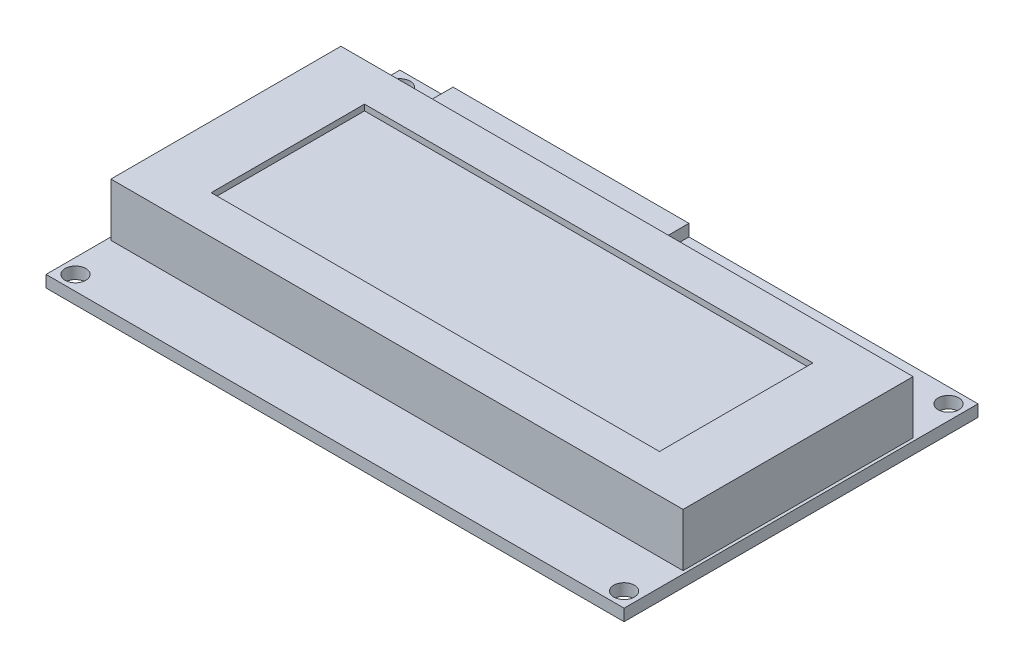
ISO-10303-21;
HEADER;
FILE_DESCRIPTION(('STEP AP214'),'2;1');
FILE_NAME('part.step','',(''),(''),'','','');
FILE_SCHEMA(('AUTOMOTIVE_DESIGN { 1 0 10303 214 1 1 1 1 }'));
ENDSEC;
DATA;
#1=APPLICATION_CONTEXT('core data for automotive mechanical design processes');
#2=APPLICATION_PROTOCOL_DEFINITION('international standard','automotive_design',2000,#1);
#3=PRODUCT_CONTEXT('',#1,'mechanical');
#4=PRODUCT('Part','Part','',(#3));
#5=PRODUCT_RELATED_PRODUCT_CATEGORY('part','',(#4));
#6=PRODUCT_DEFINITION_FORMATION('','',#4);
#7=PRODUCT_DEFINITION_CONTEXT('part definition',#1,'design');
#8=PRODUCT_DEFINITION('design','',#6,#7);
#9=PRODUCT_DEFINITION_SHAPE('','',#8);
#10=(LENGTH_UNIT() NAMED_UNIT(*) SI_UNIT(.MILLI.,.METRE.));
#11=(NAMED_UNIT(*) PLANE_ANGLE_UNIT() SI_UNIT($,.RADIAN.));
#12=(NAMED_UNIT(*) SI_UNIT($,.STERADIAN.) SOLID_ANGLE_UNIT());
#13=UNCERTAINTY_MEASURE_WITH_UNIT(LENGTH_MEASURE(1.E-05),#10,'distance_accuracy_value','');
#14=(GEOMETRIC_REPRESENTATION_CONTEXT(3) GLOBAL_UNCERTAINTY_ASSIGNED_CONTEXT((#13)) GLOBAL_UNIT_ASSIGNED_CONTEXT((#10,
#11,#12)) REPRESENTATION_CONTEXT('',''));
#15=CARTESIAN_POINT('',(0.,0.,0.));
#16=DIRECTION('',(0.,0.,1.));
#17=DIRECTION('',(1.,0.,0.));
#18=AXIS2_PLACEMENT_3D('',#15,#16,#17);
#19=CARTESIAN_POINT('',(-40.,4.,-30.));
#20=DIRECTION('',(1.,0.,0.));
#21=DIRECTION('',(0.,0.,-1.));
#22=AXIS2_PLACEMENT_3D('',#19,#20,#21);
#23=PLANE('',#22);
#24=DIRECTION('',(0.,0.,1.));
#25=VECTOR('',#24,1.);
#26=CARTESIAN_POINT('',(-40.,2.,-30.));
#27=LINE('',#26,#25);
#28=CARTESIAN_POINT('',(-40.,2.,-30.));
#29=VERTEX_POINT('',#28);
#30=CARTESIAN_POINT('',(-40.,2.,-26.));
#31=VERTEX_POINT('',#30);
#32=EDGE_CURVE('E112',#29,#31,#27,.T.);
#33=ORIENTED_EDGE('',*,*,#32,.T.);
#34=DIRECTION('',(0.,-1.,0.));
#35=VECTOR('',#34,1.);
#36=CARTESIAN_POINT('',(-40.,4.,-26.));
#37=LINE('',#36,#35);
#38=CARTESIAN_POINT('',(-40.,4.,-26.));
#39=VERTEX_POINT('',#38);
#40=EDGE_CURVE('E12',#39,#31,#37,.T.);
#41=ORIENTED_EDGE('',*,*,#40,.F.);
#42=DIRECTION('',(0.,0.,1.));
#43=VECTOR('',#42,1.);
#44=CARTESIAN_POINT('',(-40.,4.,-30.));
#45=LINE('',#44,#43);
#46=CARTESIAN_POINT('',(-40.,4.,-30.));
#47=VERTEX_POINT('',#46);
#48=EDGE_CURVE('E100',#47,#39,#45,.T.);
#49=ORIENTED_EDGE('',*,*,#48,.F.);
#50=DIRECTION('',(0.,-1.,0.));
#51=VECTOR('',#50,1.);
#52=CARTESIAN_POINT('',(-40.,4.,-30.));
#53=LINE('',#52,#51);
#54=EDGE_CURVE('E108',#47,#29,#53,.T.);
#55=ORIENTED_EDGE('',*,*,#54,.T.);
#56=EDGE_LOOP('',(#33,#41,#49,#55));
#57=FACE_BOUND('',#56,.T.);
#58=ADVANCED_FACE('F49',(#57),#23,.F.);
#59=CARTESIAN_POINT('',(-40.,4.,-26.));
#60=DIRECTION('',(0.,0.,-1.));
#61=DIRECTION('',(-1.,0.,0.));
#62=AXIS2_PLACEMENT_3D('',#59,#60,#61);
#63=PLANE('',#62);
#64=DIRECTION('',(1.,0.,0.));
#65=VECTOR('',#64,1.);
#66=CARTESIAN_POINT('',(-40.,2.,-26.));
#67=LINE('',#66,#65);
#68=CARTESIAN_POINT('',(0.,2.,-26.));
#69=VERTEX_POINT('',#68);
#70=EDGE_CURVE('E104',#31,#69,#67,.T.);
#71=ORIENTED_EDGE('',*,*,#70,.T.);
#72=DIRECTION('',(0.,-1.,0.));
#73=VECTOR('',#72,1.);
#74=CARTESIAN_POINT('',(0.,4.,-26.));
#75=LINE('',#74,#73);
#76=CARTESIAN_POINT('',(0.,4.,-26.));
#77=VERTEX_POINT('',#76);
#78=EDGE_CURVE('E57',#77,#69,#75,.T.);
#79=ORIENTED_EDGE('',*,*,#78,.F.);
#80=DIRECTION('',(1.,0.,0.));
#81=VECTOR('',#80,1.);
#82=CARTESIAN_POINT('',(-40.,4.,-26.));
#83=LINE('',#82,#81);
#84=EDGE_CURVE('E95',#39,#77,#83,.T.);
#85=ORIENTED_EDGE('',*,*,#84,.F.);
#86=ORIENTED_EDGE('',*,*,#40,.T.);
#87=EDGE_LOOP('',(#71,#79,#85,#86));
#88=FACE_BOUND('',#87,.T.);
#89=ADVANCED_FACE('F103',(#88),#63,.F.);
#90=CARTESIAN_POINT('',(0.,4.,-30.));
#91=DIRECTION('',(-1.,0.,0.));
#92=DIRECTION('',(0.,0.,1.));
#93=AXIS2_PLACEMENT_3D('',#90,#91,#92);
#94=PLANE('',#93);
#95=DIRECTION('',(0.,0.,-1.));
#96=VECTOR('',#95,1.);
#97=CARTESIAN_POINT('',(0.,2.,-30.));
#98=LINE('',#97,#96);
#99=CARTESIAN_POINT('',(0.,2.,-30.));
#100=VERTEX_POINT('',#99);
#101=EDGE_CURVE('E82',#69,#100,#98,.T.);
#102=ORIENTED_EDGE('',*,*,#101,.T.);
#103=DIRECTION('',(0.,-1.,0.));
#104=VECTOR('',#103,1.);
#105=CARTESIAN_POINT('',(0.,4.,-30.));
#106=LINE('',#105,#104);
#107=CARTESIAN_POINT('',(0.,4.,-30.));
#108=VERTEX_POINT('',#107);
#109=EDGE_CURVE('E105',#108,#100,#106,.T.);
#110=ORIENTED_EDGE('',*,*,#109,.F.);
#111=DIRECTION('',(0.,0.,-1.));
#112=VECTOR('',#111,1.);
#113=CARTESIAN_POINT('',(0.,4.,-30.));
#114=LINE('',#113,#112);
#115=EDGE_CURVE('E98',#77,#108,#114,.T.);
#116=ORIENTED_EDGE('',*,*,#115,.F.);
#117=ORIENTED_EDGE('',*,*,#78,.T.);
#118=EDGE_LOOP('',(#102,#110,#116,#117));
#119=FACE_BOUND('',#118,.T.);
#120=ADVANCED_FACE('F106',(#119),#94,.F.);
#121=CARTESIAN_POINT('',(-40.,4.,-30.));
#122=DIRECTION('',(0.,0.,1.));
#123=DIRECTION('',(1.,0.,0.));
#124=AXIS2_PLACEMENT_3D('',#121,#122,#123);
#125=PLANE('',#124);
#126=DIRECTION('',(-1.,0.,0.));
#127=VECTOR('',#126,1.);
#128=CARTESIAN_POINT('',(-40.,2.,-30.));
#129=LINE('',#128,#127);
#130=EDGE_CURVE('E88',#100,#29,#129,.T.);
#131=ORIENTED_EDGE('',*,*,#130,.T.);
#132=ORIENTED_EDGE('',*,*,#54,.F.);
#133=DIRECTION('',(-1.,0.,0.));
#134=VECTOR('',#133,1.);
#135=CARTESIAN_POINT('',(-40.,4.,-30.));
#136=LINE('',#135,#134);
#137=EDGE_CURVE('E65',#108,#47,#136,.T.);
#138=ORIENTED_EDGE('',*,*,#137,.F.);
#139=ORIENTED_EDGE('',*,*,#109,.T.);
#140=EDGE_LOOP('',(#131,#132,#138,#139));
#141=FACE_BOUND('',#140,.T.);
#142=ADVANCED_FACE('F119',(#141),#125,.F.);
#143=CARTESIAN_POINT('',(0.,4.,0.));
#144=DIRECTION('',(0.,1.,0.));
#145=DIRECTION('',(0.,0.,1.));
#146=AXIS2_PLACEMENT_3D('',#143,#144,#145);
#147=PLANE('',#146);
#148=ORIENTED_EDGE('',*,*,#48,.T.);
#149=ORIENTED_EDGE('',*,*,#84,.T.);
#150=ORIENTED_EDGE('',*,*,#115,.T.);
#151=ORIENTED_EDGE('',*,*,#137,.T.);
#152=EDGE_LOOP('',(#148,#149,#150,#151));
#153=FACE_BOUND('',#152,.T.);
#154=ADVANCED_FACE('F96',(#153),#147,.T.);
#155=CARTESIAN_POINT('',(0.,2.,0.));
#156=DIRECTION('',(0.,1.,0.));
#157=DIRECTION('',(0.,0.,1.));
#158=AXIS2_PLACEMENT_3D('',#155,#156,#157);
#159=PLANE('',#158);
#160=ORIENTED_EDGE('',*,*,#32,.F.);
#161=ORIENTED_EDGE('',*,*,#130,.F.);
#162=ORIENTED_EDGE('',*,*,#101,.F.);
#163=ORIENTED_EDGE('',*,*,#70,.F.);
#164=EDGE_LOOP('',(#160,#161,#162,#163));
#165=FACE_BOUND('',#164,.T.);
#166=ADVANCED_FACE('F122',(#165),#159,.F.);
#167=CLOSED_SHELL('',(#58,#89,#120,#142,#154,#166));
#168=MANIFOLD_SOLID_BREP('B2',#167);
#169=CARTESIAN_POINT('',(0.5,-8.,-28.5));
#170=DIRECTION('',(-1.,0.,0.));
#171=DIRECTION('',(0.,0.,1.));
#172=AXIS2_PLACEMENT_3D('',#169,#170,#171);
#173=PLANE('',#172);
#174=DIRECTION('',(0.,0.,1.));
#175=VECTOR('',#174,1.);
#176=CARTESIAN_POINT('',(0.5,0.,-28.5));
#177=LINE('',#176,#175);
#178=CARTESIAN_POINT('',(0.5,0.,-28.5));
#179=VERTEX_POINT('',#178);
#180=CARTESIAN_POINT('',(0.5,0.,-9.5));
#181=VERTEX_POINT('',#180);
#182=EDGE_CURVE('E245',#179,#181,#177,.T.);
#183=ORIENTED_EDGE('',*,*,#182,.T.);
#184=DIRECTION('',(0.,1.,0.));
#185=VECTOR('',#184,1.);
#186=CARTESIAN_POINT('',(0.5,-8.,-9.5));
#187=LINE('',#186,#185);
#188=CARTESIAN_POINT('',(0.5,-8.,-9.5));
#189=VERTEX_POINT('',#188);
#190=EDGE_CURVE('E47',#189,#181,#187,.T.);
#191=ORIENTED_EDGE('',*,*,#190,.F.);
#192=DIRECTION('',(0.,0.,1.));
#193=VECTOR('',#192,1.);
#194=CARTESIAN_POINT('',(0.5,-8.,-28.5));
#195=LINE('',#194,#193);
#196=CARTESIAN_POINT('',(0.5,-8.,-28.5));
#197=VERTEX_POINT('',#196);
#198=EDGE_CURVE('E233',#197,#189,#195,.T.);
#199=ORIENTED_EDGE('',*,*,#198,.F.);
#200=DIRECTION('',(0.,1.,0.));
#201=VECTOR('',#200,1.);
#202=CARTESIAN_POINT('',(0.5,-8.,-28.5));
#203=LINE('',#202,#201);
#204=EDGE_CURVE('E241',#197,#179,#203,.T.);
#205=ORIENTED_EDGE('',*,*,#204,.T.);
#206=EDGE_LOOP('',(#183,#191,#199,#205));
#207=FACE_BOUND('',#206,.T.);
#208=ADVANCED_FACE('F182',(#207),#173,.F.);
#209=CARTESIAN_POINT('',(0.5,-8.,-9.5));
#210=DIRECTION('',(0.,0.,-1.));
#211=DIRECTION('',(-1.,0.,0.));
#212=AXIS2_PLACEMENT_3D('',#209,#210,#211);
#213=PLANE('',#212);
#214=DIRECTION('',(-1.,0.,0.));
#215=VECTOR('',#214,1.);
#216=CARTESIAN_POINT('',(0.5,0.,-9.5));
#217=LINE('',#216,#215);
#218=CARTESIAN_POINT('',(-41.,0.,-9.50000000000001));
#219=VERTEX_POINT('',#218);
#220=EDGE_CURVE('E237',#181,#219,#217,.T.);
#221=ORIENTED_EDGE('',*,*,#220,.T.);
#222=DIRECTION('',(0.,1.,0.));
#223=VECTOR('',#222,1.);
#224=CARTESIAN_POINT('',(-41.,-8.,-9.50000000000001));
#225=LINE('',#224,#223);
#226=CARTESIAN_POINT('',(-41.,-8.,-9.50000000000001));
#227=VERTEX_POINT('',#226);
#228=EDGE_CURVE('E190',#227,#219,#225,.T.);
#229=ORIENTED_EDGE('',*,*,#228,.F.);
#230=DIRECTION('',(-1.,0.,0.));
#231=VECTOR('',#230,1.);
#232=CARTESIAN_POINT('',(0.5,-8.,-9.5));
#233=LINE('',#232,#231);
#234=EDGE_CURVE('E228',#189,#227,#233,.T.);
#235=ORIENTED_EDGE('',*,*,#234,.F.);
#236=ORIENTED_EDGE('',*,*,#190,.T.);
#237=EDGE_LOOP('',(#221,#229,#235,#236));
#238=FACE_BOUND('',#237,.T.);
#239=ADVANCED_FACE('F236',(#238),#213,.F.);
#240=CARTESIAN_POINT('',(-41.,-8.,-28.5));
#241=DIRECTION('',(1.,0.,0.));
#242=DIRECTION('',(0.,0.,-1.));
#243=AXIS2_PLACEMENT_3D('',#240,#241,#242);
#244=PLANE('',#243);
#245=DIRECTION('',(0.,0.,-1.));
#246=VECTOR('',#245,1.);
#247=CARTESIAN_POINT('',(-41.,0.,-28.5));
#248=LINE('',#247,#246);
#249=CARTESIAN_POINT('',(-41.,0.,-28.5));
#250=VERTEX_POINT('',#249);
#251=EDGE_CURVE('E215',#219,#250,#248,.T.);
#252=ORIENTED_EDGE('',*,*,#251,.T.);
#253=DIRECTION('',(0.,1.,0.));
#254=VECTOR('',#253,1.);
#255=CARTESIAN_POINT('',(-41.,-8.,-28.5));
#256=LINE('',#255,#254);
#257=CARTESIAN_POINT('',(-41.,-8.,-28.5));
#258=VERTEX_POINT('',#257);
#259=EDGE_CURVE('E238',#258,#250,#256,.T.);
#260=ORIENTED_EDGE('',*,*,#259,.F.);
#261=DIRECTION('',(0.,0.,-1.));
#262=VECTOR('',#261,1.);
#263=CARTESIAN_POINT('',(-41.,-8.,-28.5));
#264=LINE('',#263,#262);
#265=EDGE_CURVE('E231',#227,#258,#264,.T.);
#266=ORIENTED_EDGE('',*,*,#265,.F.);
#267=ORIENTED_EDGE('',*,*,#228,.T.);
#268=EDGE_LOOP('',(#252,#260,#266,#267));
#269=FACE_BOUND('',#268,.T.);
#270=ADVANCED_FACE('F239',(#269),#244,.F.);
#271=CARTESIAN_POINT('',(0.5,-8.,-28.5));
#272=DIRECTION('',(0.,0.,1.));
#273=DIRECTION('',(1.,0.,0.));
#274=AXIS2_PLACEMENT_3D('',#271,#272,#273);
#275=PLANE('',#274);
#276=DIRECTION('',(1.,0.,0.));
#277=VECTOR('',#276,1.);
#278=CARTESIAN_POINT('',(0.5,0.,-28.5));
#279=LINE('',#278,#277);
#280=EDGE_CURVE('E221',#250,#179,#279,.T.);
#281=ORIENTED_EDGE('',*,*,#280,.T.);
#282=ORIENTED_EDGE('',*,*,#204,.F.);
#283=DIRECTION('',(1.,0.,0.));
#284=VECTOR('',#283,1.);
#285=CARTESIAN_POINT('',(0.5,-8.,-28.5));
#286=LINE('',#285,#284);
#287=EDGE_CURVE('E198',#258,#197,#286,.T.);
#288=ORIENTED_EDGE('',*,*,#287,.F.);
#289=ORIENTED_EDGE('',*,*,#259,.T.);
#290=EDGE_LOOP('',(#281,#282,#288,#289));
#291=FACE_BOUND('',#290,.T.);
#292=ADVANCED_FACE('F252',(#291),#275,.F.);
#293=CARTESIAN_POINT('',(0.,-8.,0.));
#294=DIRECTION('',(0.,-1.,0.));
#295=DIRECTION('',(0.,0.,-1.));
#296=AXIS2_PLACEMENT_3D('',#293,#294,#295);
#297=PLANE('',#296);
#298=ORIENTED_EDGE('',*,*,#198,.T.);
#299=ORIENTED_EDGE('',*,*,#234,.T.);
#300=ORIENTED_EDGE('',*,*,#265,.T.);
#301=ORIENTED_EDGE('',*,*,#287,.T.);
#302=EDGE_LOOP('',(#298,#299,#300,#301));
#303=FACE_BOUND('',#302,.T.);
#304=ADVANCED_FACE('F229',(#303),#297,.T.);
#305=CARTESIAN_POINT('',(0.,0.,0.));
#306=DIRECTION('',(0.,-1.,0.));
#307=DIRECTION('',(0.,0.,-1.));
#308=AXIS2_PLACEMENT_3D('',#305,#306,#307);
#309=PLANE('',#308);
#310=ORIENTED_EDGE('',*,*,#182,.F.);
#311=ORIENTED_EDGE('',*,*,#280,.F.);
#312=ORIENTED_EDGE('',*,*,#251,.F.);
#313=ORIENTED_EDGE('',*,*,#220,.F.);
#314=EDGE_LOOP('',(#310,#311,#312,#313));
#315=FACE_BOUND('',#314,.T.);
#316=ADVANCED_FACE('F255',(#315),#309,.F.);
#317=CLOSED_SHELL('',(#208,#239,#270,#292,#304,#316));
#318=MANIFOLD_SOLID_BREP('B6',#317);
#319=CARTESIAN_POINT('',(-48.5,11.,-19.5));
#320=DIRECTION('',(1.,0.,0.));
#321=DIRECTION('',(0.,0.,-1.));
#322=AXIS2_PLACEMENT_3D('',#319,#320,#321);
#323=PLANE('',#322);
#324=DIRECTION('',(0.,0.,1.));
#325=VECTOR('',#324,1.);
#326=CARTESIAN_POINT('',(-48.5,2.,-19.5));
#327=LINE('',#326,#325);
#328=CARTESIAN_POINT('',(-48.5,2.,-19.5));
#329=VERTEX_POINT('',#328);
#330=CARTESIAN_POINT('',(-48.5,2.,19.5));
#331=VERTEX_POINT('',#330);
#332=EDGE_CURVE('E422',#329,#331,#327,.T.);
#333=ORIENTED_EDGE('',*,*,#332,.T.);
#334=DIRECTION('',(0.,-1.,0.));
#335=VECTOR('',#334,1.);
#336=CARTESIAN_POINT('',(-48.5,11.,19.5));
#337=LINE('',#336,#335);
#338=CARTESIAN_POINT('',(-48.5,11.,19.5));
#339=VERTEX_POINT('',#338);
#340=EDGE_CURVE('E180',#339,#331,#337,.T.);
#341=ORIENTED_EDGE('',*,*,#340,.F.);
#342=DIRECTION('',(0.,0.,1.));
#343=VECTOR('',#342,1.);
#344=CARTESIAN_POINT('',(-48.5,11.,-19.5));
#345=LINE('',#344,#343);
#346=CARTESIAN_POINT('',(-48.5,11.,-19.5));
#347=VERTEX_POINT('',#346);
#348=EDGE_CURVE('E426',#347,#339,#345,.T.);
#349=ORIENTED_EDGE('',*,*,#348,.F.);
#350=DIRECTION('',(0.,-1.,0.));
#351=VECTOR('',#350,1.);
#352=CARTESIAN_POINT('',(-48.5,11.,-19.5));
#353=LINE('',#352,#351);
#354=EDGE_CURVE('E432',#347,#329,#353,.T.);
#355=ORIENTED_EDGE('',*,*,#354,.T.);
#356=EDGE_LOOP('',(#333,#341,#349,#355));
#357=FACE_BOUND('',#356,.T.);
#358=ADVANCED_FACE('F314',(#357),#323,.F.);
#359=CARTESIAN_POINT('',(-48.5,11.,19.5));
#360=DIRECTION('',(0.,0.,-1.));
#361=DIRECTION('',(-1.,0.,0.));
#362=AXIS2_PLACEMENT_3D('',#359,#360,#361);
#363=PLANE('',#362);
#364=DIRECTION('',(1.,0.,0.));
#365=VECTOR('',#364,1.);
#366=CARTESIAN_POINT('',(-48.5,2.,19.5));
#367=LINE('',#366,#365);
#368=CARTESIAN_POINT('',(48.5,2.,19.5));
#369=VERTEX_POINT('',#368);
#370=EDGE_CURVE('E435',#331,#369,#367,.T.);
#371=ORIENTED_EDGE('',*,*,#370,.T.);
#372=DIRECTION('',(0.,-1.,0.));
#373=VECTOR('',#372,1.);
#374=CARTESIAN_POINT('',(48.5,11.,19.5));
#375=LINE('',#374,#373);
#376=CARTESIAN_POINT('',(48.5,11.,19.5));
#377=VERTEX_POINT('',#376);
#378=EDGE_CURVE('E321',#377,#369,#375,.T.);
#379=ORIENTED_EDGE('',*,*,#378,.F.);
#380=DIRECTION('',(1.,0.,0.));
#381=VECTOR('',#380,1.);
#382=CARTESIAN_POINT('',(-48.5,11.,19.5));
#383=LINE('',#382,#381);
#384=EDGE_CURVE('E365',#339,#377,#383,.T.);
#385=ORIENTED_EDGE('',*,*,#384,.F.);
#386=ORIENTED_EDGE('',*,*,#340,.T.);
#387=EDGE_LOOP('',(#371,#379,#385,#386));
#388=FACE_BOUND('',#387,.T.);
#389=ADVANCED_FACE('F464',(#388),#363,.F.);
#390=CARTESIAN_POINT('',(48.5,11.,-19.5));
#391=DIRECTION('',(-1.,0.,0.));
#392=DIRECTION('',(0.,0.,1.));
#393=AXIS2_PLACEMENT_3D('',#390,#391,#392);
#394=PLANE('',#393);
#395=DIRECTION('',(0.,0.,-1.));
#396=VECTOR('',#395,1.);
#397=CARTESIAN_POINT('',(48.5,2.,-19.5));
#398=LINE('',#397,#396);
#399=CARTESIAN_POINT('',(48.5,2.,-19.5));
#400=VERTEX_POINT('',#399);
#401=EDGE_CURVE('E437',#369,#400,#398,.T.);
#402=ORIENTED_EDGE('',*,*,#401,.T.);
#403=DIRECTION('',(0.,-1.,0.));
#404=VECTOR('',#403,1.);
#405=CARTESIAN_POINT('',(48.5,11.,-19.5));
#406=LINE('',#405,#404);
#407=CARTESIAN_POINT('',(48.5,11.,-19.5));
#408=VERTEX_POINT('',#407);
#409=EDGE_CURVE('E441',#408,#400,#406,.T.);
#410=ORIENTED_EDGE('',*,*,#409,.F.);
#411=DIRECTION('',(0.,0.,-1.));
#412=VECTOR('',#411,1.);
#413=CARTESIAN_POINT('',(48.5,11.,-19.5));
#414=LINE('',#413,#412);
#415=EDGE_CURVE('E429',#377,#408,#414,.T.);
#416=ORIENTED_EDGE('',*,*,#415,.F.);
#417=ORIENTED_EDGE('',*,*,#378,.T.);
#418=EDGE_LOOP('',(#402,#410,#416,#417));
#419=FACE_BOUND('',#418,.T.);
#420=ADVANCED_FACE('F446',(#419),#394,.F.);
#421=CARTESIAN_POINT('',(-48.5,11.,-19.5));
#422=DIRECTION('',(0.,0.,1.));
#423=DIRECTION('',(1.,0.,0.));
#424=AXIS2_PLACEMENT_3D('',#421,#422,#423);
#425=PLANE('',#424);
#426=DIRECTION('',(-1.,0.,0.));
#427=VECTOR('',#426,1.);
#428=CARTESIAN_POINT('',(-48.5,2.,-19.5));
#429=LINE('',#428,#427);
#430=EDGE_CURVE('E358',#400,#329,#429,.T.);
#431=ORIENTED_EDGE('',*,*,#430,.T.);
#432=ORIENTED_EDGE('',*,*,#354,.F.);
#433=DIRECTION('',(-1.,0.,0.));
#434=VECTOR('',#433,1.);
#435=CARTESIAN_POINT('',(-48.5,11.,-19.5));
#436=LINE('',#435,#434);
#437=EDGE_CURVE('E337',#408,#347,#436,.T.);
#438=ORIENTED_EDGE('',*,*,#437,.F.);
#439=ORIENTED_EDGE('',*,*,#409,.T.);
#440=EDGE_LOOP('',(#431,#432,#438,#439));
#441=FACE_BOUND('',#440,.T.);
#442=ADVANCED_FACE('F454',(#441),#425,.F.);
#443=CARTESIAN_POINT('',(0.,11.,0.));
#444=DIRECTION('',(0.,1.,0.));
#445=DIRECTION('',(0.,0.,1.));
#446=AXIS2_PLACEMENT_3D('',#443,#444,#445);
#447=PLANE('',#446);
#448=DIRECTION('',(0.,0.,1.));
#449=VECTOR('',#448,1.);
#450=CARTESIAN_POINT('',(-38.,11.,-13.));
#451=LINE('',#450,#449);
#452=CARTESIAN_POINT('',(-38.,11.,-13.));
#453=VERTEX_POINT('',#452);
#454=CARTESIAN_POINT('',(-38.,11.,13.));
#455=VERTEX_POINT('',#454);
#456=EDGE_CURVE('E328',#453,#455,#451,.T.);
#457=ORIENTED_EDGE('',*,*,#456,.F.);
#458=DIRECTION('',(-1.,0.,0.));
#459=VECTOR('',#458,1.);
#460=CARTESIAN_POINT('',(-38.,11.,-13.));
#461=LINE('',#460,#459);
#462=CARTESIAN_POINT('',(38.,11.,-13.));
#463=VERTEX_POINT('',#462);
#464=EDGE_CURVE('E407',#463,#453,#461,.T.);
#465=ORIENTED_EDGE('',*,*,#464,.F.);
#466=DIRECTION('',(0.,0.,-1.));
#467=VECTOR('',#466,1.);
#468=CARTESIAN_POINT('',(38.,11.,-13.));
#469=LINE('',#468,#467);
#470=CARTESIAN_POINT('',(38.,11.,13.));
#471=VERTEX_POINT('',#470);
#472=EDGE_CURVE('E410',#471,#463,#469,.T.);
#473=ORIENTED_EDGE('',*,*,#472,.F.);
#474=DIRECTION('',(1.,0.,0.));
#475=VECTOR('',#474,1.);
#476=CARTESIAN_POINT('',(-38.,11.,13.));
#477=LINE('',#476,#475);
#478=EDGE_CURVE('E416',#455,#471,#477,.T.);
#479=ORIENTED_EDGE('',*,*,#478,.F.);
#480=EDGE_LOOP('',(#457,#465,#473,#479));
#481=FACE_BOUND('',#480,.T.);
#482=ORIENTED_EDGE('',*,*,#348,.T.);
#483=ORIENTED_EDGE('',*,*,#384,.T.);
#484=ORIENTED_EDGE('',*,*,#415,.T.);
#485=ORIENTED_EDGE('',*,*,#437,.T.);
#486=EDGE_LOOP('',(#482,#483,#484,#485));
#487=FACE_BOUND('',#486,.T.);
#488=ADVANCED_FACE('F456',(#481,#487),#447,.T.);
#489=CARTESIAN_POINT('',(0.,2.,0.));
#490=DIRECTION('',(0.,1.,0.));
#491=DIRECTION('',(0.,0.,1.));
#492=AXIS2_PLACEMENT_3D('',#489,#490,#491);
#493=PLANE('',#492);
#494=ORIENTED_EDGE('',*,*,#332,.F.);
#495=ORIENTED_EDGE('',*,*,#430,.F.);
#496=ORIENTED_EDGE('',*,*,#401,.F.);
#497=ORIENTED_EDGE('',*,*,#370,.F.);
#498=EDGE_LOOP('',(#494,#495,#496,#497));
#499=FACE_BOUND('',#498,.T.);
#500=ADVANCED_FACE('F450',(#499),#493,.F.);
#501=CARTESIAN_POINT('',(-38.,10.,-13.));
#502=DIRECTION('',(-1.,0.,0.));
#503=DIRECTION('',(0.,0.,1.));
#504=AXIS2_PLACEMENT_3D('',#501,#502,#503);
#505=PLANE('',#504);
#506=ORIENTED_EDGE('',*,*,#456,.T.);
#507=DIRECTION('',(0.,1.,0.));
#508=VECTOR('',#507,1.);
#509=CARTESIAN_POINT('',(-38.,10.,13.));
#510=LINE('',#509,#508);
#511=CARTESIAN_POINT('',(-38.,10.,13.));
#512=VERTEX_POINT('',#511);
#513=EDGE_CURVE('E385',#512,#455,#510,.T.);
#514=ORIENTED_EDGE('',*,*,#513,.F.);
#515=DIRECTION('',(0.,0.,1.));
#516=VECTOR('',#515,1.);
#517=CARTESIAN_POINT('',(-38.,10.,-13.));
#518=LINE('',#517,#516);
#519=CARTESIAN_POINT('',(-38.,10.,-13.));
#520=VERTEX_POINT('',#519);
#521=EDGE_CURVE('E389',#520,#512,#518,.T.);
#522=ORIENTED_EDGE('',*,*,#521,.F.);
#523=DIRECTION('',(0.,1.,0.));
#524=VECTOR('',#523,1.);
#525=CARTESIAN_POINT('',(-38.,10.,-13.));
#526=LINE('',#525,#524);
#527=EDGE_CURVE('E420',#520,#453,#526,.T.);
#528=ORIENTED_EDGE('',*,*,#527,.T.);
#529=EDGE_LOOP('',(#506,#514,#522,#528));
#530=FACE_BOUND('',#529,.T.);
#531=ADVANCED_FACE('F387',(#530),#505,.F.);
#532=CARTESIAN_POINT('',(-38.,10.,-13.));
#533=DIRECTION('',(0.,0.,-1.));
#534=DIRECTION('',(-1.,0.,0.));
#535=AXIS2_PLACEMENT_3D('',#532,#533,#534);
#536=PLANE('',#535);
#537=ORIENTED_EDGE('',*,*,#464,.T.);
#538=ORIENTED_EDGE('',*,*,#527,.F.);
#539=DIRECTION('',(-1.,0.,0.));
#540=VECTOR('',#539,1.);
#541=CARTESIAN_POINT('',(-38.,10.,-13.));
#542=LINE('',#541,#540);
#543=CARTESIAN_POINT('',(38.,10.,-13.));
#544=VERTEX_POINT('',#543);
#545=EDGE_CURVE('E395',#544,#520,#542,.T.);
#546=ORIENTED_EDGE('',*,*,#545,.F.);
#547=DIRECTION('',(0.,1.,0.));
#548=VECTOR('',#547,1.);
#549=CARTESIAN_POINT('',(38.,10.,-13.));
#550=LINE('',#549,#548);
#551=EDGE_CURVE('E423',#544,#463,#550,.T.);
#552=ORIENTED_EDGE('',*,*,#551,.T.);
#553=EDGE_LOOP('',(#537,#538,#546,#552));
#554=FACE_BOUND('',#553,.T.);
#555=ADVANCED_FACE('F503',(#554),#536,.F.);
#556=CARTESIAN_POINT('',(38.,10.,-13.));
#557=DIRECTION('',(1.,0.,0.));
#558=DIRECTION('',(0.,0.,-1.));
#559=AXIS2_PLACEMENT_3D('',#556,#557,#558);
#560=PLANE('',#559);
#561=ORIENTED_EDGE('',*,*,#472,.T.);
#562=ORIENTED_EDGE('',*,*,#551,.F.);
#563=DIRECTION('',(0.,0.,-1.));
#564=VECTOR('',#563,1.);
#565=CARTESIAN_POINT('',(38.,10.,-13.));
#566=LINE('',#565,#564);
#567=CARTESIAN_POINT('',(38.,10.,13.));
#568=VERTEX_POINT('',#567);
#569=EDGE_CURVE('E403',#568,#544,#566,.T.);
#570=ORIENTED_EDGE('',*,*,#569,.F.);
#571=DIRECTION('',(0.,1.,0.));
#572=VECTOR('',#571,1.);
#573=CARTESIAN_POINT('',(38.,10.,13.));
#574=LINE('',#573,#572);
#575=EDGE_CURVE('E394',#568,#471,#574,.T.);
#576=ORIENTED_EDGE('',*,*,#575,.T.);
#577=EDGE_LOOP('',(#561,#562,#570,#576));
#578=FACE_BOUND('',#577,.T.);
#579=ADVANCED_FACE('F512',(#578),#560,.F.);
#580=CARTESIAN_POINT('',(-38.,10.,13.));
#581=DIRECTION('',(0.,0.,1.));
#582=DIRECTION('',(1.,0.,0.));
#583=AXIS2_PLACEMENT_3D('',#580,#581,#582);
#584=PLANE('',#583);
#585=ORIENTED_EDGE('',*,*,#478,.T.);
#586=ORIENTED_EDGE('',*,*,#575,.F.);
#587=DIRECTION('',(1.,0.,0.));
#588=VECTOR('',#587,1.);
#589=CARTESIAN_POINT('',(-38.,10.,13.));
#590=LINE('',#589,#588);
#591=EDGE_CURVE('E398',#512,#568,#590,.T.);
#592=ORIENTED_EDGE('',*,*,#591,.F.);
#593=ORIENTED_EDGE('',*,*,#513,.T.);
#594=EDGE_LOOP('',(#585,#586,#592,#593));
#595=FACE_BOUND('',#594,.T.);
#596=ADVANCED_FACE('F399',(#595),#584,.F.);
#597=CARTESIAN_POINT('',(0.,10.,0.));
#598=DIRECTION('',(0.,1.,0.));
#599=DIRECTION('',(0.,0.,1.));
#600=AXIS2_PLACEMENT_3D('',#597,#598,#599);
#601=PLANE('',#600);
#602=ORIENTED_EDGE('',*,*,#521,.T.);
#603=ORIENTED_EDGE('',*,*,#591,.T.);
#604=ORIENTED_EDGE('',*,*,#569,.T.);
#605=ORIENTED_EDGE('',*,*,#545,.T.);
#606=EDGE_LOOP('',(#602,#603,#604,#605));
#607=FACE_BOUND('',#606,.T.);
#608=ADVANCED_FACE('F405',(#607),#601,.T.);
#609=CLOSED_SHELL('',(#358,#389,#420,#442,#488,#500,#531,#555,#579,#596,#608));
#610=MANIFOLD_SOLID_BREP('B41',#609);
#611=CARTESIAN_POINT('',(-49.,2.,30.));
#612=DIRECTION('',(1.,0.,0.));
#613=DIRECTION('',(0.,0.,-1.));
#614=AXIS2_PLACEMENT_3D('',#611,#612,#613);
#615=PLANE('',#614);
#616=DIRECTION('',(0.,0.,1.));
#617=VECTOR('',#616,1.);
#618=CARTESIAN_POINT('',(-49.,0.,30.));
#619=LINE('',#618,#617);
#620=CARTESIAN_POINT('',(-49.,0.,-30.));
#621=VERTEX_POINT('',#620);
#622=CARTESIAN_POINT('',(-49.,0.,30.));
#623=VERTEX_POINT('',#622);
#624=EDGE_CURVE('E618',#621,#623,#619,.T.);
#625=ORIENTED_EDGE('',*,*,#624,.T.);
#626=DIRECTION('',(0.,-1.,0.));
#627=VECTOR('',#626,1.);
#628=CARTESIAN_POINT('',(-49.,2.,30.));
#629=LINE('',#628,#627);
#630=CARTESIAN_POINT('',(-49.,2.,30.));
#631=VERTEX_POINT('',#630);
#632=EDGE_CURVE('E312',#631,#623,#629,.T.);
#633=ORIENTED_EDGE('',*,*,#632,.F.);
#634=DIRECTION('',(0.,0.,1.));
#635=VECTOR('',#634,1.);
#636=CARTESIAN_POINT('',(-49.,2.,30.));
#637=LINE('',#636,#635);
#638=CARTESIAN_POINT('',(-49.,2.,-30.));
#639=VERTEX_POINT('',#638);
#640=EDGE_CURVE('E605',#639,#631,#637,.T.);
#641=ORIENTED_EDGE('',*,*,#640,.F.);
#642=DIRECTION('',(0.,-1.,0.));
#643=VECTOR('',#642,1.);
#644=CARTESIAN_POINT('',(-49.,2.,-30.));
#645=LINE('',#644,#643);
#646=EDGE_CURVE('E614',#639,#621,#645,.T.);
#647=ORIENTED_EDGE('',*,*,#646,.T.);
#648=EDGE_LOOP('',(#625,#633,#641,#647));
#649=FACE_BOUND('',#648,.T.);
#650=ADVANCED_FACE('F552',(#649),#615,.F.);
#651=CARTESIAN_POINT('',(-49.,2.,30.));
#652=DIRECTION('',(0.,0.,-1.));
#653=DIRECTION('',(-1.,0.,0.));
#654=AXIS2_PLACEMENT_3D('',#651,#652,#653);
#655=PLANE('',#654);
#656=DIRECTION('',(1.,0.,0.));
#657=VECTOR('',#656,1.);
#658=CARTESIAN_POINT('',(-49.,0.,30.));
#659=LINE('',#658,#657);
#660=CARTESIAN_POINT('',(49.,0.,30.));
#661=VERTEX_POINT('',#660);
#662=EDGE_CURVE('E609',#623,#661,#659,.T.);
#663=ORIENTED_EDGE('',*,*,#662,.T.);
#664=DIRECTION('',(0.,-1.,0.));
#665=VECTOR('',#664,1.);
#666=CARTESIAN_POINT('',(49.,2.,30.));
#667=LINE('',#666,#665);
#668=CARTESIAN_POINT('',(49.,2.,30.));
#669=VERTEX_POINT('',#668);
#670=EDGE_CURVE('E561',#669,#661,#667,.T.);
#671=ORIENTED_EDGE('',*,*,#670,.F.);
#672=DIRECTION('',(1.,0.,0.));
#673=VECTOR('',#672,1.);
#674=CARTESIAN_POINT('',(-49.,2.,30.));
#675=LINE('',#674,#673);
#676=EDGE_CURVE('E600',#631,#669,#675,.T.);
#677=ORIENTED_EDGE('',*,*,#676,.F.);
#678=ORIENTED_EDGE('',*,*,#632,.T.);
#679=EDGE_LOOP('',(#663,#671,#677,#678));
#680=FACE_BOUND('',#679,.T.);
#681=ADVANCED_FACE('F608',(#680),#655,.F.);
#682=CARTESIAN_POINT('',(49.,2.,30.));
#683=DIRECTION('',(-1.,0.,0.));
#684=DIRECTION('',(0.,0.,1.));
#685=AXIS2_PLACEMENT_3D('',#682,#683,#684);
#686=PLANE('',#685);
#687=DIRECTION('',(0.,0.,-1.));
#688=VECTOR('',#687,1.);
#689=CARTESIAN_POINT('',(49.,0.,30.));
#690=LINE('',#689,#688);
#691=CARTESIAN_POINT('',(49.,0.,-30.));
#692=VERTEX_POINT('',#691);
#693=EDGE_CURVE('E587',#661,#692,#690,.T.);
#694=ORIENTED_EDGE('',*,*,#693,.T.);
#695=DIRECTION('',(0.,-1.,0.));
#696=VECTOR('',#695,1.);
#697=CARTESIAN_POINT('',(49.,2.,-30.));
#698=LINE('',#697,#696);
#699=CARTESIAN_POINT('',(49.,2.,-30.));
#700=VERTEX_POINT('',#699);
#701=EDGE_CURVE('E610',#700,#692,#698,.T.);
#702=ORIENTED_EDGE('',*,*,#701,.F.);
#703=DIRECTION('',(0.,0.,-1.));
#704=VECTOR('',#703,1.);
#705=CARTESIAN_POINT('',(49.,2.,30.));
#706=LINE('',#705,#704);
#707=EDGE_CURVE('E603',#669,#700,#706,.T.);
#708=ORIENTED_EDGE('',*,*,#707,.F.);
#709=ORIENTED_EDGE('',*,*,#670,.T.);
#710=EDGE_LOOP('',(#694,#702,#708,#709));
#711=FACE_BOUND('',#710,.T.);
#712=ADVANCED_FACE('F612',(#711),#686,.F.);
#713=CARTESIAN_POINT('',(-49.,2.,-30.));
#714=DIRECTION('',(0.,0.,1.));
#715=DIRECTION('',(1.,0.,0.));
#716=AXIS2_PLACEMENT_3D('',#713,#714,#715);
#717=PLANE('',#716);
#718=DIRECTION('',(-1.,0.,0.));
#719=VECTOR('',#718,1.);
#720=CARTESIAN_POINT('',(-49.,0.,-30.));
#721=LINE('',#720,#719);
#722=EDGE_CURVE('E593',#692,#621,#721,.T.);
#723=ORIENTED_EDGE('',*,*,#722,.T.);
#724=ORIENTED_EDGE('',*,*,#646,.F.);
#725=DIRECTION('',(-1.,0.,0.));
#726=VECTOR('',#725,1.);
#727=CARTESIAN_POINT('',(-49.,2.,-30.));
#728=LINE('',#727,#726);
#729=EDGE_CURVE('E570',#700,#639,#728,.T.);
#730=ORIENTED_EDGE('',*,*,#729,.F.);
#731=ORIENTED_EDGE('',*,*,#701,.T.);
#732=EDGE_LOOP('',(#723,#724,#730,#731));
#733=FACE_BOUND('',#732,.T.);
#734=ADVANCED_FACE('F654',(#733),#717,.F.);
#735=CARTESIAN_POINT('',(0.,2.,0.));
#736=DIRECTION('',(0.,-1.,0.));
#737=DIRECTION('',(0.,0.,-1.));
#738=AXIS2_PLACEMENT_3D('',#735,#736,#737);
#739=PLANE('',#738);
#740=CARTESIAN_POINT('',(-46.5,2.,27.5));
#741=DIRECTION('',(0.,1.,0.));
#742=DIRECTION('',(0.,0.,1.));
#743=AXIS2_PLACEMENT_3D('',#740,#741,#742);
#744=CIRCLE('',#743,1.75);
#745=CARTESIAN_POINT('',(-46.5,2.,29.25));
#746=VERTEX_POINT('',#745);
#747=EDGE_CURVE('E736',#746,#746,#744,.T.);
#748=ORIENTED_EDGE('',*,*,#747,.F.);
#749=EDGE_LOOP('',(#748));
#750=FACE_BOUND('',#749,.T.);
#751=CARTESIAN_POINT('',(46.5,2.,27.5));
#752=DIRECTION('',(0.,1.,0.));
#753=DIRECTION('',(0.,0.,1.));
#754=AXIS2_PLACEMENT_3D('',#751,#752,#753);
#755=CIRCLE('',#754,1.75);
#756=CARTESIAN_POINT('',(46.5,2.,29.25));
#757=VERTEX_POINT('',#756);
#758=EDGE_CURVE('E733',#757,#757,#755,.T.);
#759=ORIENTED_EDGE('',*,*,#758,.F.);
#760=EDGE_LOOP('',(#759));
#761=FACE_BOUND('',#760,.T.);
#762=CARTESIAN_POINT('',(46.5,2.,-27.5));
#763=DIRECTION('',(0.,1.,0.));
#764=DIRECTION('',(0.,0.,1.));
#765=AXIS2_PLACEMENT_3D('',#762,#763,#764);
#766=CIRCLE('',#765,1.75);
#767=CARTESIAN_POINT('',(46.5,2.,-25.75));
#768=VERTEX_POINT('',#767);
#769=EDGE_CURVE('E735',#768,#768,#766,.T.);
#770=ORIENTED_EDGE('',*,*,#769,.F.);
#771=EDGE_LOOP('',(#770));
#772=FACE_BOUND('',#771,.T.);
#773=CARTESIAN_POINT('',(-46.5,2.,-27.5));
#774=DIRECTION('',(0.,1.,0.));
#775=DIRECTION('',(0.,0.,1.));
#776=AXIS2_PLACEMENT_3D('',#773,#774,#775);
#777=CIRCLE('',#776,1.75);
#778=CARTESIAN_POINT('',(-46.5,2.,-25.75));
#779=VERTEX_POINT('',#778);
#780=EDGE_CURVE('E630',#779,#779,#777,.T.);
#781=ORIENTED_EDGE('',*,*,#780,.F.);
#782=EDGE_LOOP('',(#781));
#783=FACE_BOUND('',#782,.T.);
#784=ORIENTED_EDGE('',*,*,#640,.T.);
#785=ORIENTED_EDGE('',*,*,#676,.T.);
#786=ORIENTED_EDGE('',*,*,#707,.T.);
#787=ORIENTED_EDGE('',*,*,#729,.T.);
#788=EDGE_LOOP('',(#784,#785,#786,#787));
#789=FACE_BOUND('',#788,.T.);
#790=ADVANCED_FACE('F601',(#750,#761,#772,#783,#789),#739,.F.);
#791=CARTESIAN_POINT('',(0.,0.,0.));
#792=DIRECTION('',(0.,-1.,0.));
#793=DIRECTION('',(0.,0.,-1.));
#794=AXIS2_PLACEMENT_3D('',#791,#792,#793);
#795=PLANE('',#794);
#796=CARTESIAN_POINT('',(-46.5,0.,27.5));
#797=DIRECTION('',(0.,-1.,0.));
#798=DIRECTION('',(0.,0.,-1.));
#799=AXIS2_PLACEMENT_3D('',#796,#797,#798);
#800=CIRCLE('',#799,1.75);
#801=CARTESIAN_POINT('',(-46.5,0.,25.75));
#802=VERTEX_POINT('',#801);
#803=EDGE_CURVE('E555',#802,#802,#800,.T.);
#804=ORIENTED_EDGE('',*,*,#803,.F.);
#805=EDGE_LOOP('',(#804));
#806=FACE_BOUND('',#805,.T.);
#807=CARTESIAN_POINT('',(46.5,0.,27.5));
#808=DIRECTION('',(0.,-1.,0.));
#809=DIRECTION('',(0.,0.,-1.));
#810=AXIS2_PLACEMENT_3D('',#807,#808,#809);
#811=CIRCLE('',#810,1.75);
#812=CARTESIAN_POINT('',(46.5,0.,25.75));
#813=VERTEX_POINT('',#812);
#814=EDGE_CURVE('E632',#813,#813,#811,.T.);
#815=ORIENTED_EDGE('',*,*,#814,.F.);
#816=EDGE_LOOP('',(#815));
#817=FACE_BOUND('',#816,.T.);
#818=CARTESIAN_POINT('',(46.5,0.,-27.5));
#819=DIRECTION('',(0.,-1.,0.));
#820=DIRECTION('',(0.,0.,-1.));
#821=AXIS2_PLACEMENT_3D('',#818,#819,#820);
#822=CIRCLE('',#821,1.75);
#823=CARTESIAN_POINT('',(46.5,0.,-29.25));
#824=VERTEX_POINT('',#823);
#825=EDGE_CURVE('E629',#824,#824,#822,.T.);
#826=ORIENTED_EDGE('',*,*,#825,.F.);
#827=EDGE_LOOP('',(#826));
#828=FACE_BOUND('',#827,.T.);
#829=CARTESIAN_POINT('',(-46.5,0.,-27.5));
#830=DIRECTION('',(0.,-1.,0.));
#831=DIRECTION('',(0.,0.,-1.));
#832=AXIS2_PLACEMENT_3D('',#829,#830,#831);
#833=CIRCLE('',#832,1.75);
#834=CARTESIAN_POINT('',(-46.5,0.,-29.25));
#835=VERTEX_POINT('',#834);
#836=EDGE_CURVE('E626',#835,#835,#833,.T.);
#837=ORIENTED_EDGE('',*,*,#836,.F.);
#838=EDGE_LOOP('',(#837));
#839=FACE_BOUND('',#838,.T.);
#840=ORIENTED_EDGE('',*,*,#624,.F.);
#841=ORIENTED_EDGE('',*,*,#722,.F.);
#842=ORIENTED_EDGE('',*,*,#693,.F.);
#843=ORIENTED_EDGE('',*,*,#662,.F.);
#844=EDGE_LOOP('',(#840,#841,#842,#843));
#845=FACE_BOUND('',#844,.T.);
#846=ADVANCED_FACE('F642',(#806,#817,#828,#839,#845),#795,.T.);
#847=CARTESIAN_POINT('',(-46.5,-8.,-27.5));
#848=DIRECTION('',(0.,1.,0.));
#849=DIRECTION('',(0.,0.,1.));
#850=AXIS2_PLACEMENT_3D('',#847,#848,#849);
#851=CYLINDRICAL_SURFACE('',#850,1.75);
#852=ORIENTED_EDGE('',*,*,#836,.T.);
#853=EDGE_LOOP('',(#852));
#854=FACE_BOUND('',#853,.T.);
#855=ORIENTED_EDGE('',*,*,#780,.T.);
#856=EDGE_LOOP('',(#855));
#857=FACE_BOUND('',#856,.T.);
#858=ADVANCED_FACE('F645',(#854,#857),#851,.F.);
#859=CARTESIAN_POINT('',(46.5,-8.,-27.5));
#860=DIRECTION('',(0.,1.,0.));
#861=DIRECTION('',(0.,0.,1.));
#862=AXIS2_PLACEMENT_3D('',#859,#860,#861);
#863=CYLINDRICAL_SURFACE('',#862,1.75);
#864=ORIENTED_EDGE('',*,*,#825,.T.);
#865=EDGE_LOOP('',(#864));
#866=FACE_BOUND('',#865,.T.);
#867=ORIENTED_EDGE('',*,*,#769,.T.);
#868=EDGE_LOOP('',(#867));
#869=FACE_BOUND('',#868,.T.);
#870=ADVANCED_FACE('F699',(#866,#869),#863,.F.);
#871=CARTESIAN_POINT('',(46.5,-8.,27.5));
#872=DIRECTION('',(0.,1.,0.));
#873=DIRECTION('',(0.,0.,1.));
#874=AXIS2_PLACEMENT_3D('',#871,#872,#873);
#875=CYLINDRICAL_SURFACE('',#874,1.75);
#876=ORIENTED_EDGE('',*,*,#814,.T.);
#877=EDGE_LOOP('',(#876));
#878=FACE_BOUND('',#877,.T.);
#879=ORIENTED_EDGE('',*,*,#758,.T.);
#880=EDGE_LOOP('',(#879));
#881=FACE_BOUND('',#880,.T.);
#882=ADVANCED_FACE('F709',(#878,#881),#875,.F.);
#883=CARTESIAN_POINT('',(-46.5,-8.,27.5));
#884=DIRECTION('',(0.,1.,0.));
#885=DIRECTION('',(0.,0.,1.));
#886=AXIS2_PLACEMENT_3D('',#883,#884,#885);
#887=CYLINDRICAL_SURFACE('',#886,1.75);
#888=ORIENTED_EDGE('',*,*,#803,.T.);
#889=EDGE_LOOP('',(#888));
#890=FACE_BOUND('',#889,.T.);
#891=ORIENTED_EDGE('',*,*,#747,.T.);
#892=EDGE_LOOP('',(#891));
#893=FACE_BOUND('',#892,.T.);
#894=ADVANCED_FACE('F639',(#890,#893),#887,.F.);
#895=CLOSED_SHELL('',(#650,#681,#712,#734,#790,#846,#858,#870,#882,#894));
#896=MANIFOLD_SOLID_BREP('B174',#895);
#897=ADVANCED_BREP_SHAPE_REPRESENTATION('',(#18,#168,#318,#610,#896),#14);
#898=SHAPE_DEFINITION_REPRESENTATION(#9,#897);
ENDSEC;
END-ISO-10303-21;
